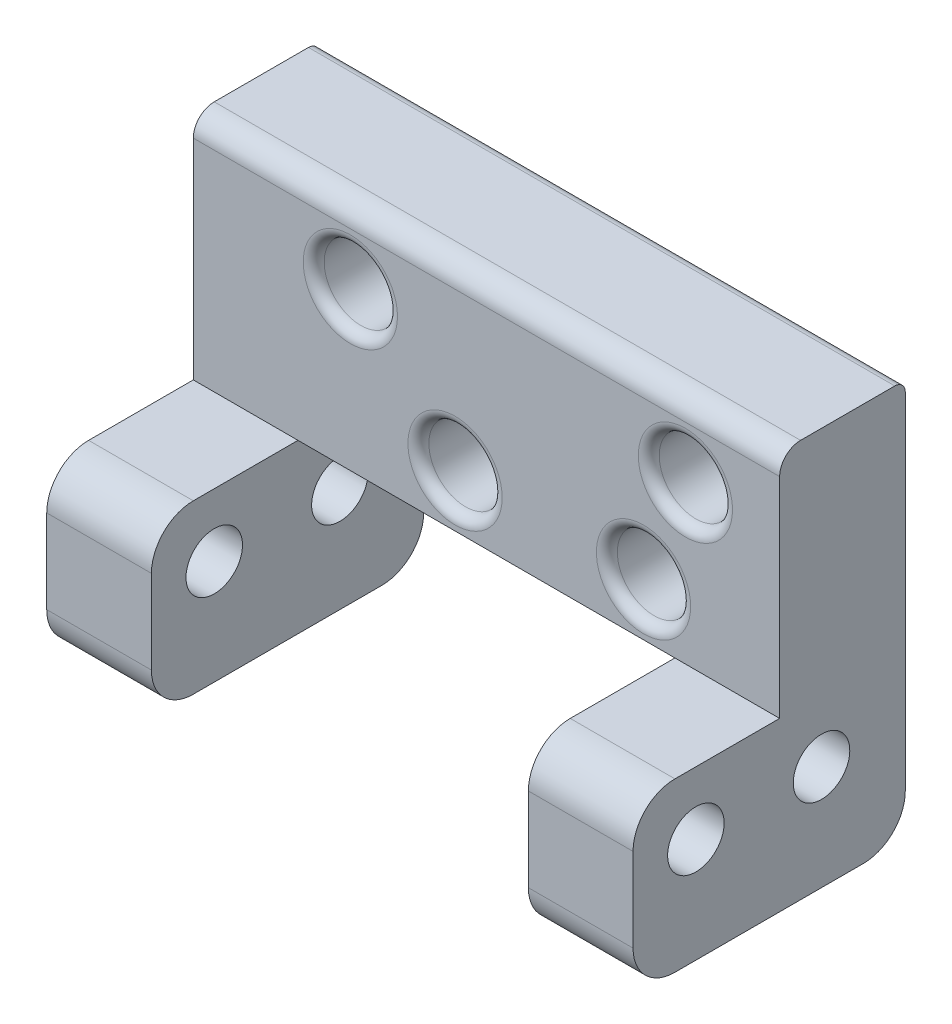
ISO-10303-21;
HEADER;
FILE_DESCRIPTION(('STEP AP214'),'2;1');
FILE_NAME('part.step','',(''),(''),'','','');
FILE_SCHEMA(('AUTOMOTIVE_DESIGN { 1 0 10303 214 1 1 1 1 }'));
ENDSEC;
DATA;
#1=APPLICATION_CONTEXT('core data for automotive mechanical design processes');
#2=APPLICATION_PROTOCOL_DEFINITION('international standard','automotive_design',2000,#1);
#3=PRODUCT_CONTEXT('',#1,'mechanical');
#4=PRODUCT('Part','Part','',(#3));
#5=PRODUCT_RELATED_PRODUCT_CATEGORY('part','',(#4));
#6=PRODUCT_DEFINITION_FORMATION('','',#4);
#7=PRODUCT_DEFINITION_CONTEXT('part definition',#1,'design');
#8=PRODUCT_DEFINITION('design','',#6,#7);
#9=PRODUCT_DEFINITION_SHAPE('','',#8);
#10=(LENGTH_UNIT() NAMED_UNIT(*) SI_UNIT(.MILLI.,.METRE.));
#11=(NAMED_UNIT(*) PLANE_ANGLE_UNIT() SI_UNIT($,.RADIAN.));
#12=(NAMED_UNIT(*) SI_UNIT($,.STERADIAN.) SOLID_ANGLE_UNIT());
#13=UNCERTAINTY_MEASURE_WITH_UNIT(LENGTH_MEASURE(1.E-05),#10,'distance_accuracy_value','');
#14=(GEOMETRIC_REPRESENTATION_CONTEXT(3) GLOBAL_UNCERTAINTY_ASSIGNED_CONTEXT((#13)) GLOBAL_UNIT_ASSIGNED_CONTEXT((#10,
#11,#12)) REPRESENTATION_CONTEXT('',''));
#15=CARTESIAN_POINT('',(0.,0.,0.));
#16=DIRECTION('',(0.,0.,1.));
#17=DIRECTION('',(1.,0.,0.));
#18=AXIS2_PLACEMENT_3D('',#15,#16,#17);
#19=CARTESIAN_POINT('',(0.,0.,6.));
#20=DIRECTION('',(0.,0.,1.));
#21=DIRECTION('',(1.,0.,0.));
#22=AXIS2_PLACEMENT_3D('',#19,#20,#21);
#23=PLANE('',#22);
#24=CARTESIAN_POINT('',(9.5,7.5,6.));
#25=DIRECTION('',(0.,0.,1.));
#26=DIRECTION('',(1.,0.,0.));
#27=AXIS2_PLACEMENT_3D('',#24,#25,#26);
#28=CIRCLE('',#27,2.25);
#29=CARTESIAN_POINT('',(11.75,7.5,6.));
#30=VERTEX_POINT('',#29);
#31=EDGE_CURVE('E316',#30,#30,#28,.F.);
#32=ORIENTED_EDGE('',*,*,#31,.T.);
#33=EDGE_LOOP('',(#32));
#34=FACE_BOUND('',#33,.T.);
#35=CARTESIAN_POINT('',(-6.49999999999999,7.5,6.));
#36=DIRECTION('',(0.,0.,1.));
#37=DIRECTION('',(1.,0.,0.));
#38=AXIS2_PLACEMENT_3D('',#35,#36,#37);
#39=CIRCLE('',#38,2.25);
#40=CARTESIAN_POINT('',(-4.24999999999999,7.5,6.));
#41=VERTEX_POINT('',#40);
#42=EDGE_CURVE('E313',#41,#41,#39,.F.);
#43=ORIENTED_EDGE('',*,*,#42,.T.);
#44=EDGE_LOOP('',(#43));
#45=FACE_BOUND('',#44,.T.);
#46=CARTESIAN_POINT('',(-1.5,2.5,6.));
#47=DIRECTION('',(0.,0.,1.));
#48=DIRECTION('',(1.,0.,0.));
#49=AXIS2_PLACEMENT_3D('',#46,#47,#48);
#50=CIRCLE('',#49,2.25);
#51=CARTESIAN_POINT('',(0.750000000000004,2.5,6.));
#52=VERTEX_POINT('',#51);
#53=EDGE_CURVE('E310',#52,#52,#50,.F.);
#54=ORIENTED_EDGE('',*,*,#53,.T.);
#55=EDGE_LOOP('',(#54));
#56=FACE_BOUND('',#55,.T.);
#57=CARTESIAN_POINT('',(7.5,2.5,6.));
#58=DIRECTION('',(0.,0.,1.));
#59=DIRECTION('',(1.,0.,0.));
#60=AXIS2_PLACEMENT_3D('',#57,#58,#59);
#61=CIRCLE('',#60,2.25);
#62=CARTESIAN_POINT('',(9.75,2.5,6.));
#63=VERTEX_POINT('',#62);
#64=EDGE_CURVE('E307',#63,#63,#61,.F.);
#65=ORIENTED_EDGE('',*,*,#64,.T.);
#66=EDGE_LOOP('',(#65));
#67=FACE_BOUND('',#66,.T.);
#68=DIRECTION('',(0.,1.,0.));
#69=VECTOR('',#68,1.);
#70=CARTESIAN_POINT('',(14.,11.,6.));
#71=LINE('',#70,#69);
#72=CARTESIAN_POINT('',(14.,0.,6.));
#73=VERTEX_POINT('',#72);
#74=CARTESIAN_POINT('',(14.,10.,6.));
#75=VERTEX_POINT('',#74);
#76=EDGE_CURVE('E178',#73,#75,#71,.T.);
#77=ORIENTED_EDGE('',*,*,#76,.T.);
#78=DIRECTION('',(-1.,0.,0.));
#79=VECTOR('',#78,1.);
#80=CARTESIAN_POINT('',(-14.,10.,6.));
#81=LINE('',#80,#79);
#82=CARTESIAN_POINT('',(-14.,10.,6.));
#83=VERTEX_POINT('',#82);
#84=EDGE_CURVE('E264',#75,#83,#81,.T.);
#85=ORIENTED_EDGE('',*,*,#84,.T.);
#86=DIRECTION('',(0.,-1.,0.));
#87=VECTOR('',#86,1.);
#88=CARTESIAN_POINT('',(-14.,11.,6.));
#89=LINE('',#88,#87);
#90=CARTESIAN_POINT('',(-14.,0.,6.));
#91=VERTEX_POINT('',#90);
#92=EDGE_CURVE('E179',#83,#91,#89,.T.);
#93=ORIENTED_EDGE('',*,*,#92,.T.);
#94=DIRECTION('',(-1.,0.,0.));
#95=VECTOR('',#94,1.);
#96=CARTESIAN_POINT('',(0.,0.,6.));
#97=LINE('',#96,#95);
#98=CARTESIAN_POINT('',(-9.,0.,6.));
#99=VERTEX_POINT('',#98);
#100=EDGE_CURVE('E191',#99,#91,#97,.T.);
#101=ORIENTED_EDGE('',*,*,#100,.F.);
#102=DIRECTION('',(1.,0.,0.));
#103=VECTOR('',#102,1.);
#104=CARTESIAN_POINT('',(-9.,0.,6.));
#105=LINE('',#104,#103);
#106=CARTESIAN_POINT('',(9.,0.,6.));
#107=VERTEX_POINT('',#106);
#108=EDGE_CURVE('E168',#99,#107,#105,.T.);
#109=ORIENTED_EDGE('',*,*,#108,.T.);
#110=DIRECTION('',(1.,0.,0.));
#111=VECTOR('',#110,1.);
#112=CARTESIAN_POINT('',(-1.63014581273465,0.,6.));
#113=LINE('',#112,#111);
#114=EDGE_CURVE('E225',#107,#73,#113,.T.);
#115=ORIENTED_EDGE('',*,*,#114,.T.);
#116=EDGE_LOOP('',(#77,#85,#93,#101,#109,#115));
#117=FACE_BOUND('',#116,.T.);
#118=ADVANCED_FACE('F34',(#34,#45,#56,#67,#117),#23,.T.);
#119=CARTESIAN_POINT('',(-14.,11.,6.));
#120=DIRECTION('',(1.,0.,0.));
#121=DIRECTION('',(0.,1.,0.));
#122=AXIS2_PLACEMENT_3D('',#119,#120,#121);
#123=PLANE('',#122);
#124=CARTESIAN_POINT('',(-14.,-3.,10.));
#125=DIRECTION('',(1.,0.,0.));
#126=DIRECTION('',(0.,1.,0.));
#127=AXIS2_PLACEMENT_3D('',#124,#125,#126);
#128=CIRCLE('',#127,1.35);
#129=CARTESIAN_POINT('',(-14.,-1.65,10.));
#130=VERTEX_POINT('',#129);
#131=EDGE_CURVE('E271',#130,#130,#128,.T.);
#132=ORIENTED_EDGE('',*,*,#131,.T.);
#133=EDGE_LOOP('',(#132));
#134=FACE_BOUND('',#133,.T.);
#135=CARTESIAN_POINT('',(-14.,-3.,4.));
#136=DIRECTION('',(1.,0.,0.));
#137=DIRECTION('',(0.,1.,0.));
#138=AXIS2_PLACEMENT_3D('',#135,#136,#137);
#139=CIRCLE('',#138,1.35);
#140=CARTESIAN_POINT('',(-14.,-1.65,4.));
#141=VERTEX_POINT('',#140);
#142=EDGE_CURVE('E267',#141,#141,#139,.T.);
#143=ORIENTED_EDGE('',*,*,#142,.T.);
#144=EDGE_LOOP('',(#143));
#145=FACE_BOUND('',#144,.T.);
#146=DIRECTION('',(0.,0.,-1.));
#147=VECTOR('',#146,1.);
#148=CARTESIAN_POINT('',(-14.,-8.,6.));
#149=LINE('',#148,#147);
#150=CARTESIAN_POINT('',(-14.,-8.,11.));
#151=VERTEX_POINT('',#150);
#152=CARTESIAN_POINT('',(-14.,-8.,2.));
#153=VERTEX_POINT('',#152);
#154=EDGE_CURVE('E261',#151,#153,#149,.T.);
#155=ORIENTED_EDGE('',*,*,#154,.F.);
#156=CARTESIAN_POINT('',(-14.,-6.,11.));
#157=DIRECTION('',(1.,0.,0.));
#158=DIRECTION('',(0.,1.,0.));
#159=AXIS2_PLACEMENT_3D('',#156,#157,#158);
#160=CIRCLE('',#159,2.);
#161=CARTESIAN_POINT('',(-14.,-6.,13.));
#162=VERTEX_POINT('',#161);
#163=EDGE_CURVE('E376',#151,#162,#160,.F.);
#164=ORIENTED_EDGE('',*,*,#163,.T.);
#165=DIRECTION('',(0.,1.,0.));
#166=VECTOR('',#165,1.);
#167=CARTESIAN_POINT('',(-14.,-8.,13.));
#168=LINE('',#167,#166);
#169=CARTESIAN_POINT('',(-14.,-1.99999999999999,13.));
#170=VERTEX_POINT('',#169);
#171=EDGE_CURVE('E204',#162,#170,#168,.T.);
#172=ORIENTED_EDGE('',*,*,#171,.T.);
#173=CARTESIAN_POINT('',(-14.,-2.,11.));
#174=DIRECTION('',(1.,0.,0.));
#175=DIRECTION('',(0.,1.,0.));
#176=AXIS2_PLACEMENT_3D('',#173,#174,#175);
#177=CIRCLE('',#176,2.);
#178=CARTESIAN_POINT('',(-14.,0.,11.));
#179=VERTEX_POINT('',#178);
#180=EDGE_CURVE('E372',#170,#179,#177,.F.);
#181=ORIENTED_EDGE('',*,*,#180,.T.);
#182=DIRECTION('',(0.,0.,-1.));
#183=VECTOR('',#182,1.);
#184=CARTESIAN_POINT('',(-14.,0.,0.));
#185=LINE('',#184,#183);
#186=EDGE_CURVE('E200',#179,#91,#185,.T.);
#187=ORIENTED_EDGE('',*,*,#186,.T.);
#188=ORIENTED_EDGE('',*,*,#92,.F.);
#189=CARTESIAN_POINT('',(-14.,10.,5.));
#190=DIRECTION('',(1.,0.,0.));
#191=DIRECTION('',(0.,1.,0.));
#192=AXIS2_PLACEMENT_3D('',#189,#190,#191);
#193=CIRCLE('',#192,1.);
#194=CARTESIAN_POINT('',(-14.,11.,5.));
#195=VERTEX_POINT('',#194);
#196=EDGE_CURVE('E273',#83,#195,#193,.F.);
#197=ORIENTED_EDGE('',*,*,#196,.T.);
#198=DIRECTION('',(0.,0.,-1.));
#199=VECTOR('',#198,1.);
#200=CARTESIAN_POINT('',(-14.,11.,6.));
#201=LINE('',#200,#199);
#202=CARTESIAN_POINT('',(-14.,11.,0.5));
#203=VERTEX_POINT('',#202);
#204=EDGE_CURVE('E237',#195,#203,#201,.T.);
#205=ORIENTED_EDGE('',*,*,#204,.T.);
#206=CARTESIAN_POINT('',(-14.,10.5,0.5));
#207=DIRECTION('',(1.,0.,0.));
#208=DIRECTION('',(0.,1.,0.));
#209=AXIS2_PLACEMENT_3D('',#206,#207,#208);
#210=CIRCLE('',#209,0.5);
#211=CARTESIAN_POINT('',(-14.,10.5,0.));
#212=VERTEX_POINT('',#211);
#213=EDGE_CURVE('E282',#203,#212,#210,.F.);
#214=ORIENTED_EDGE('',*,*,#213,.T.);
#215=DIRECTION('',(0.,-1.,0.));
#216=VECTOR('',#215,1.);
#217=CARTESIAN_POINT('',(-14.,11.,0.));
#218=LINE('',#217,#216);
#219=CARTESIAN_POINT('',(-14.,-6.,0.));
#220=VERTEX_POINT('',#219);
#221=EDGE_CURVE('E233',#212,#220,#218,.T.);
#222=ORIENTED_EDGE('',*,*,#221,.T.);
#223=CARTESIAN_POINT('',(-14.,-6.,2.));
#224=DIRECTION('',(1.,0.,0.));
#225=DIRECTION('',(0.,1.,0.));
#226=AXIS2_PLACEMENT_3D('',#223,#224,#225);
#227=CIRCLE('',#226,2.);
#228=EDGE_CURVE('E374',#220,#153,#227,.F.);
#229=ORIENTED_EDGE('',*,*,#228,.T.);
#230=EDGE_LOOP('',(#155,#164,#172,#181,#187,#188,#197,#205,#214,#222,#229));
#231=FACE_BOUND('',#230,.T.);
#232=ADVANCED_FACE('F395',(#134,#145,#231),#123,.F.);
#233=CARTESIAN_POINT('',(-14.,-8.,6.));
#234=DIRECTION('',(0.,1.,0.));
#235=DIRECTION('',(0.,0.,1.));
#236=AXIS2_PLACEMENT_3D('',#233,#234,#235);
#237=PLANE('',#236);
#238=DIRECTION('',(0.,0.,-1.));
#239=VECTOR('',#238,1.);
#240=CARTESIAN_POINT('',(-9.,-8.,6.));
#241=LINE('',#240,#239);
#242=CARTESIAN_POINT('',(-9.,-8.,11.));
#243=VERTEX_POINT('',#242);
#244=CARTESIAN_POINT('',(-9.,-8.,2.));
#245=VERTEX_POINT('',#244);
#246=EDGE_CURVE('E187',#243,#245,#241,.T.);
#247=ORIENTED_EDGE('',*,*,#246,.F.);
#248=DIRECTION('',(-1.,0.,0.));
#249=VECTOR('',#248,1.);
#250=CARTESIAN_POINT('',(-14.,-8.,11.));
#251=LINE('',#250,#249);
#252=EDGE_CURVE('E369',#243,#151,#251,.T.);
#253=ORIENTED_EDGE('',*,*,#252,.T.);
#254=ORIENTED_EDGE('',*,*,#154,.T.);
#255=DIRECTION('',(1.,0.,0.));
#256=VECTOR('',#255,1.);
#257=CARTESIAN_POINT('',(-14.,-8.,2.));
#258=LINE('',#257,#256);
#259=EDGE_CURVE('E366',#153,#245,#258,.T.);
#260=ORIENTED_EDGE('',*,*,#259,.T.);
#261=EDGE_LOOP('',(#247,#253,#254,#260));
#262=FACE_BOUND('',#261,.T.);
#263=ADVANCED_FACE('F390',(#262),#237,.F.);
#264=CARTESIAN_POINT('',(-9.,0.,6.));
#265=DIRECTION('',(-1.,0.,0.));
#266=DIRECTION('',(0.,-1.,0.));
#267=AXIS2_PLACEMENT_3D('',#264,#265,#266);
#268=PLANE('',#267);
#269=CARTESIAN_POINT('',(-9.,-3.,10.));
#270=DIRECTION('',(-1.,0.,0.));
#271=DIRECTION('',(0.,-1.,0.));
#272=AXIS2_PLACEMENT_3D('',#269,#270,#271);
#273=CIRCLE('',#272,1.35);
#274=CARTESIAN_POINT('',(-9.,-4.35,10.));
#275=VERTEX_POINT('',#274);
#276=EDGE_CURVE('E268',#275,#275,#273,.F.);
#277=ORIENTED_EDGE('',*,*,#276,.F.);
#278=EDGE_LOOP('',(#277));
#279=FACE_BOUND('',#278,.T.);
#280=CARTESIAN_POINT('',(-9.,-3.,4.));
#281=DIRECTION('',(-1.,0.,0.));
#282=DIRECTION('',(0.,-1.,0.));
#283=AXIS2_PLACEMENT_3D('',#280,#281,#282);
#284=CIRCLE('',#283,1.35);
#285=CARTESIAN_POINT('',(-9.,-4.35,4.));
#286=VERTEX_POINT('',#285);
#287=EDGE_CURVE('E207',#286,#286,#284,.F.);
#288=ORIENTED_EDGE('',*,*,#287,.F.);
#289=EDGE_LOOP('',(#288));
#290=FACE_BOUND('',#289,.T.);
#291=DIRECTION('',(0.,-1.,0.));
#292=VECTOR('',#291,1.);
#293=CARTESIAN_POINT('',(-9.,-8.00000000000001,13.));
#294=LINE('',#293,#292);
#295=CARTESIAN_POINT('',(-9.,-2.,13.));
#296=VERTEX_POINT('',#295);
#297=CARTESIAN_POINT('',(-9.,-6.,13.));
#298=VERTEX_POINT('',#297);
#299=EDGE_CURVE('E198',#296,#298,#294,.T.);
#300=ORIENTED_EDGE('',*,*,#299,.T.);
#301=CARTESIAN_POINT('',(-9.,-6.,11.));
#302=DIRECTION('',(-1.,0.,0.));
#303=DIRECTION('',(0.,-1.,0.));
#304=AXIS2_PLACEMENT_3D('',#301,#302,#303);
#305=CIRCLE('',#304,2.);
#306=EDGE_CURVE('E42',#298,#243,#305,.F.);
#307=ORIENTED_EDGE('',*,*,#306,.T.);
#308=ORIENTED_EDGE('',*,*,#246,.T.);
#309=CARTESIAN_POINT('',(-9.,-6.,2.));
#310=DIRECTION('',(-1.,0.,0.));
#311=DIRECTION('',(0.,-1.,0.));
#312=AXIS2_PLACEMENT_3D('',#309,#310,#311);
#313=CIRCLE('',#312,2.);
#314=CARTESIAN_POINT('',(-9.,-6.,0.));
#315=VERTEX_POINT('',#314);
#316=EDGE_CURVE('E384',#245,#315,#313,.F.);
#317=ORIENTED_EDGE('',*,*,#316,.T.);
#318=DIRECTION('',(0.,1.,0.));
#319=VECTOR('',#318,1.);
#320=CARTESIAN_POINT('',(-9.,0.,0.));
#321=LINE('',#320,#319);
#322=CARTESIAN_POINT('',(-9.,0.,0.));
#323=VERTEX_POINT('',#322);
#324=EDGE_CURVE('E186',#315,#323,#321,.T.);
#325=ORIENTED_EDGE('',*,*,#324,.T.);
#326=DIRECTION('',(0.,0.,-1.));
#327=VECTOR('',#326,1.);
#328=CARTESIAN_POINT('',(-9.,0.,6.));
#329=LINE('',#328,#327);
#330=EDGE_CURVE('E171',#99,#323,#329,.T.);
#331=ORIENTED_EDGE('',*,*,#330,.F.);
#332=DIRECTION('',(0.,0.,1.));
#333=VECTOR('',#332,1.);
#334=CARTESIAN_POINT('',(-9.,0.,0.));
#335=LINE('',#334,#333);
#336=CARTESIAN_POINT('',(-9.,0.,11.));
#337=VERTEX_POINT('',#336);
#338=EDGE_CURVE('E183',#99,#337,#335,.T.);
#339=ORIENTED_EDGE('',*,*,#338,.T.);
#340=CARTESIAN_POINT('',(-9.,-2.,11.));
#341=DIRECTION('',(-1.,0.,0.));
#342=DIRECTION('',(0.,-1.,0.));
#343=AXIS2_PLACEMENT_3D('',#340,#341,#342);
#344=CIRCLE('',#343,2.);
#345=EDGE_CURVE('E382',#337,#296,#344,.F.);
#346=ORIENTED_EDGE('',*,*,#345,.T.);
#347=EDGE_LOOP('',(#300,#307,#308,#317,#325,#331,#339,#346));
#348=FACE_BOUND('',#347,.T.);
#349=ADVANCED_FACE('F182',(#279,#290,#348),#268,.F.);
#350=CARTESIAN_POINT('',(-9.,0.,6.));
#351=DIRECTION('',(0.,1.,0.));
#352=DIRECTION('',(0.,0.,1.));
#353=AXIS2_PLACEMENT_3D('',#350,#351,#352);
#354=PLANE('',#353);
#355=DIRECTION('',(1.,0.,0.));
#356=VECTOR('',#355,1.);
#357=CARTESIAN_POINT('',(-9.,0.,0.));
#358=LINE('',#357,#356);
#359=CARTESIAN_POINT('',(9.,0.,0.));
#360=VERTEX_POINT('',#359);
#361=EDGE_CURVE('E241',#323,#360,#358,.T.);
#362=ORIENTED_EDGE('',*,*,#361,.T.);
#363=DIRECTION('',(0.,0.,-1.));
#364=VECTOR('',#363,1.);
#365=CARTESIAN_POINT('',(9.,0.,6.));
#366=LINE('',#365,#364);
#367=EDGE_CURVE('E174',#107,#360,#366,.T.);
#368=ORIENTED_EDGE('',*,*,#367,.F.);
#369=ORIENTED_EDGE('',*,*,#108,.F.);
#370=ORIENTED_EDGE('',*,*,#330,.T.);
#371=EDGE_LOOP('',(#362,#368,#369,#370));
#372=FACE_BOUND('',#371,.T.);
#373=ADVANCED_FACE('F170',(#372),#354,.F.);
#374=CARTESIAN_POINT('',(9.,0.,6.));
#375=DIRECTION('',(1.,0.,0.));
#376=DIRECTION('',(0.,1.,0.));
#377=AXIS2_PLACEMENT_3D('',#374,#375,#376);
#378=PLANE('',#377);
#379=CARTESIAN_POINT('',(9.,-3.,10.));
#380=DIRECTION('',(1.,0.,0.));
#381=DIRECTION('',(0.,1.,0.));
#382=AXIS2_PLACEMENT_3D('',#379,#380,#381);
#383=CIRCLE('',#382,1.35);
#384=CARTESIAN_POINT('',(9.,-1.65,10.));
#385=VERTEX_POINT('',#384);
#386=EDGE_CURVE('E211',#385,#385,#383,.T.);
#387=ORIENTED_EDGE('',*,*,#386,.T.);
#388=EDGE_LOOP('',(#387));
#389=FACE_BOUND('',#388,.T.);
#390=CARTESIAN_POINT('',(9.,-3.,4.));
#391=DIRECTION('',(1.,0.,0.));
#392=DIRECTION('',(0.,1.,0.));
#393=AXIS2_PLACEMENT_3D('',#390,#391,#392);
#394=CIRCLE('',#393,1.35);
#395=CARTESIAN_POINT('',(9.,-1.65,4.));
#396=VERTEX_POINT('',#395);
#397=EDGE_CURVE('E217',#396,#396,#394,.T.);
#398=ORIENTED_EDGE('',*,*,#397,.T.);
#399=EDGE_LOOP('',(#398));
#400=FACE_BOUND('',#399,.T.);
#401=DIRECTION('',(0.,-1.,0.));
#402=VECTOR('',#401,1.);
#403=CARTESIAN_POINT('',(9.,0.,0.));
#404=LINE('',#403,#402);
#405=CARTESIAN_POINT('',(9.,-6.,0.));
#406=VERTEX_POINT('',#405);
#407=EDGE_CURVE('E243',#360,#406,#404,.T.);
#408=ORIENTED_EDGE('',*,*,#407,.T.);
#409=CARTESIAN_POINT('',(9.,-6.,2.));
#410=DIRECTION('',(1.,0.,0.));
#411=DIRECTION('',(0.,1.,0.));
#412=AXIS2_PLACEMENT_3D('',#409,#410,#411);
#413=CIRCLE('',#412,2.);
#414=CARTESIAN_POINT('',(9.,-8.,2.));
#415=VERTEX_POINT('',#414);
#416=EDGE_CURVE('E356',#406,#415,#413,.F.);
#417=ORIENTED_EDGE('',*,*,#416,.T.);
#418=DIRECTION('',(0.,0.,-1.));
#419=VECTOR('',#418,1.);
#420=CARTESIAN_POINT('',(9.,-8.,6.));
#421=LINE('',#420,#419);
#422=CARTESIAN_POINT('',(9.,-8.,11.));
#423=VERTEX_POINT('',#422);
#424=EDGE_CURVE('E255',#423,#415,#421,.T.);
#425=ORIENTED_EDGE('',*,*,#424,.F.);
#426=CARTESIAN_POINT('',(9.,-6.,11.));
#427=DIRECTION('',(1.,0.,0.));
#428=DIRECTION('',(0.,1.,0.));
#429=AXIS2_PLACEMENT_3D('',#426,#427,#428);
#430=CIRCLE('',#429,2.);
#431=CARTESIAN_POINT('',(9.,-6.,13.));
#432=VERTEX_POINT('',#431);
#433=EDGE_CURVE('E354',#423,#432,#430,.F.);
#434=ORIENTED_EDGE('',*,*,#433,.T.);
#435=DIRECTION('',(0.,1.,0.));
#436=VECTOR('',#435,1.);
#437=CARTESIAN_POINT('',(9.,-7.99999999999999,13.));
#438=LINE('',#437,#436);
#439=CARTESIAN_POINT('',(9.,-2.,13.));
#440=VERTEX_POINT('',#439);
#441=EDGE_CURVE('E221',#432,#440,#438,.T.);
#442=ORIENTED_EDGE('',*,*,#441,.T.);
#443=CARTESIAN_POINT('',(9.,-2.,11.));
#444=DIRECTION('',(1.,0.,0.));
#445=DIRECTION('',(0.,1.,0.));
#446=AXIS2_PLACEMENT_3D('',#443,#444,#445);
#447=CIRCLE('',#446,2.);
#448=CARTESIAN_POINT('',(9.,0.,11.));
#449=VERTEX_POINT('',#448);
#450=EDGE_CURVE('E352',#440,#449,#447,.F.);
#451=ORIENTED_EDGE('',*,*,#450,.T.);
#452=DIRECTION('',(0.,0.,-1.));
#453=VECTOR('',#452,1.);
#454=CARTESIAN_POINT('',(9.,0.,6.));
#455=LINE('',#454,#453);
#456=EDGE_CURVE('E224',#449,#107,#455,.T.);
#457=ORIENTED_EDGE('',*,*,#456,.T.);
#458=ORIENTED_EDGE('',*,*,#367,.T.);
#459=EDGE_LOOP('',(#408,#417,#425,#434,#442,#451,#457,#458));
#460=FACE_BOUND('',#459,.T.);
#461=ADVANCED_FACE('F427',(#389,#400,#460),#378,.F.);
#462=CARTESIAN_POINT('',(14.,-8.,6.));
#463=DIRECTION('',(0.,1.,0.));
#464=DIRECTION('',(0.,0.,1.));
#465=AXIS2_PLACEMENT_3D('',#462,#463,#464);
#466=PLANE('',#465);
#467=ORIENTED_EDGE('',*,*,#424,.T.);
#468=DIRECTION('',(1.,0.,0.));
#469=VECTOR('',#468,1.);
#470=CARTESIAN_POINT('',(14.,-8.,2.));
#471=LINE('',#470,#469);
#472=CARTESIAN_POINT('',(14.,-8.,2.));
#473=VERTEX_POINT('',#472);
#474=EDGE_CURVE('E339',#415,#473,#471,.T.);
#475=ORIENTED_EDGE('',*,*,#474,.T.);
#476=DIRECTION('',(0.,0.,-1.));
#477=VECTOR('',#476,1.);
#478=CARTESIAN_POINT('',(14.,-8.,6.));
#479=LINE('',#478,#477);
#480=CARTESIAN_POINT('',(14.,-8.,11.));
#481=VERTEX_POINT('',#480);
#482=EDGE_CURVE('E252',#481,#473,#479,.T.);
#483=ORIENTED_EDGE('',*,*,#482,.F.);
#484=DIRECTION('',(1.,0.,0.));
#485=VECTOR('',#484,1.);
#486=CARTESIAN_POINT('',(9.,-8.,11.));
#487=LINE('',#486,#485);
#488=EDGE_CURVE('E337',#481,#423,#487,.F.);
#489=ORIENTED_EDGE('',*,*,#488,.T.);
#490=EDGE_LOOP('',(#467,#475,#483,#489));
#491=FACE_BOUND('',#490,.T.);
#492=ADVANCED_FACE('F435',(#491),#466,.F.);
#493=CARTESIAN_POINT('',(14.,11.,6.));
#494=DIRECTION('',(-1.,0.,0.));
#495=DIRECTION('',(0.,-1.,0.));
#496=AXIS2_PLACEMENT_3D('',#493,#494,#495);
#497=PLANE('',#496);
#498=CARTESIAN_POINT('',(14.,-3.,10.));
#499=DIRECTION('',(1.,0.,0.));
#500=DIRECTION('',(0.,1.,0.));
#501=AXIS2_PLACEMENT_3D('',#498,#499,#500);
#502=CIRCLE('',#501,1.35);
#503=CARTESIAN_POINT('',(14.,-1.65,10.));
#504=VERTEX_POINT('',#503);
#505=EDGE_CURVE('E195',#504,#504,#502,.T.);
#506=ORIENTED_EDGE('',*,*,#505,.F.);
#507=EDGE_LOOP('',(#506));
#508=FACE_BOUND('',#507,.T.);
#509=CARTESIAN_POINT('',(14.,-3.,4.));
#510=DIRECTION('',(1.,0.,0.));
#511=DIRECTION('',(0.,1.,0.));
#512=AXIS2_PLACEMENT_3D('',#509,#510,#511);
#513=CIRCLE('',#512,1.35);
#514=CARTESIAN_POINT('',(14.,-1.65,4.));
#515=VERTEX_POINT('',#514);
#516=EDGE_CURVE('E214',#515,#515,#513,.T.);
#517=ORIENTED_EDGE('',*,*,#516,.F.);
#518=EDGE_LOOP('',(#517));
#519=FACE_BOUND('',#518,.T.);
#520=ORIENTED_EDGE('',*,*,#482,.T.);
#521=CARTESIAN_POINT('',(14.,-6.,2.));
#522=DIRECTION('',(-1.,0.,0.));
#523=DIRECTION('',(0.,-1.,0.));
#524=AXIS2_PLACEMENT_3D('',#521,#522,#523);
#525=CIRCLE('',#524,2.);
#526=CARTESIAN_POINT('',(14.,-6.,0.));
#527=VERTEX_POINT('',#526);
#528=EDGE_CURVE('E346',#473,#527,#525,.F.);
#529=ORIENTED_EDGE('',*,*,#528,.T.);
#530=DIRECTION('',(0.,1.,0.));
#531=VECTOR('',#530,1.);
#532=CARTESIAN_POINT('',(14.,11.,0.));
#533=LINE('',#532,#531);
#534=CARTESIAN_POINT('',(14.,10.5,0.));
#535=VERTEX_POINT('',#534);
#536=EDGE_CURVE('E234',#527,#535,#533,.T.);
#537=ORIENTED_EDGE('',*,*,#536,.T.);
#538=CARTESIAN_POINT('',(14.,10.5,0.5));
#539=DIRECTION('',(-1.,0.,0.));
#540=DIRECTION('',(0.,-1.,0.));
#541=AXIS2_PLACEMENT_3D('',#538,#539,#540);
#542=CIRCLE('',#541,0.5);
#543=CARTESIAN_POINT('',(14.,11.,0.5));
#544=VERTEX_POINT('',#543);
#545=EDGE_CURVE('E299',#535,#544,#542,.F.);
#546=ORIENTED_EDGE('',*,*,#545,.T.);
#547=DIRECTION('',(0.,0.,-1.));
#548=VECTOR('',#547,1.);
#549=CARTESIAN_POINT('',(14.,11.,6.));
#550=LINE('',#549,#548);
#551=CARTESIAN_POINT('',(14.,11.,5.));
#552=VERTEX_POINT('',#551);
#553=EDGE_CURVE('E249',#552,#544,#550,.T.);
#554=ORIENTED_EDGE('',*,*,#553,.F.);
#555=CARTESIAN_POINT('',(14.,10.,5.));
#556=DIRECTION('',(-1.,0.,0.));
#557=DIRECTION('',(0.,-1.,0.));
#558=AXIS2_PLACEMENT_3D('',#555,#556,#557);
#559=CIRCLE('',#558,1.);
#560=EDGE_CURVE('E277',#552,#75,#559,.F.);
#561=ORIENTED_EDGE('',*,*,#560,.T.);
#562=ORIENTED_EDGE('',*,*,#76,.F.);
#563=DIRECTION('',(0.,0.,1.));
#564=VECTOR('',#563,1.);
#565=CARTESIAN_POINT('',(14.,0.,6.));
#566=LINE('',#565,#564);
#567=CARTESIAN_POINT('',(14.,0.,11.));
#568=VERTEX_POINT('',#567);
#569=EDGE_CURVE('E220',#73,#568,#566,.T.);
#570=ORIENTED_EDGE('',*,*,#569,.T.);
#571=CARTESIAN_POINT('',(14.,-2.,11.));
#572=DIRECTION('',(-1.,0.,0.));
#573=DIRECTION('',(0.,-1.,0.));
#574=AXIS2_PLACEMENT_3D('',#571,#572,#573);
#575=CIRCLE('',#574,2.);
#576=CARTESIAN_POINT('',(14.,-2.,13.));
#577=VERTEX_POINT('',#576);
#578=EDGE_CURVE('E342',#568,#577,#575,.F.);
#579=ORIENTED_EDGE('',*,*,#578,.T.);
#580=DIRECTION('',(0.,-1.,0.));
#581=VECTOR('',#580,1.);
#582=CARTESIAN_POINT('',(14.,-8.,13.));
#583=LINE('',#582,#581);
#584=CARTESIAN_POINT('',(14.,-6.,13.));
#585=VERTEX_POINT('',#584);
#586=EDGE_CURVE('E228',#577,#585,#583,.T.);
#587=ORIENTED_EDGE('',*,*,#586,.T.);
#588=CARTESIAN_POINT('',(14.,-6.,11.));
#589=DIRECTION('',(-1.,0.,0.));
#590=DIRECTION('',(0.,-1.,0.));
#591=AXIS2_PLACEMENT_3D('',#588,#589,#590);
#592=CIRCLE('',#591,2.);
#593=EDGE_CURVE('E344',#585,#481,#592,.F.);
#594=ORIENTED_EDGE('',*,*,#593,.T.);
#595=EDGE_LOOP('',(#520,#529,#537,#546,#554,#561,#562,#570,#579,#587,#594));
#596=FACE_BOUND('',#595,.T.);
#597=ADVANCED_FACE('F411',(#508,#519,#596),#497,.F.);
#598=CARTESIAN_POINT('',(14.,11.,6.));
#599=DIRECTION('',(0.,-1.,0.));
#600=DIRECTION('',(1.,0.,0.));
#601=AXIS2_PLACEMENT_3D('',#598,#599,#600);
#602=PLANE('',#601);
#603=ORIENTED_EDGE('',*,*,#553,.T.);
#604=DIRECTION('',(-1.,0.,0.));
#605=VECTOR('',#604,1.);
#606=CARTESIAN_POINT('',(14.,11.,0.5));
#607=LINE('',#606,#605);
#608=EDGE_CURVE('E279',#544,#203,#607,.T.);
#609=ORIENTED_EDGE('',*,*,#608,.T.);
#610=ORIENTED_EDGE('',*,*,#204,.F.);
#611=DIRECTION('',(-1.,0.,0.));
#612=VECTOR('',#611,1.);
#613=CARTESIAN_POINT('',(14.,11.,5.));
#614=LINE('',#613,#612);
#615=EDGE_CURVE('E275',#195,#552,#614,.F.);
#616=ORIENTED_EDGE('',*,*,#615,.T.);
#617=EDGE_LOOP('',(#603,#609,#610,#616));
#618=FACE_BOUND('',#617,.T.);
#619=ADVANCED_FACE('F404',(#618),#602,.F.);
#620=CARTESIAN_POINT('',(0.,0.,0.));
#621=DIRECTION('',(0.,0.,1.));
#622=DIRECTION('',(1.,0.,0.));
#623=AXIS2_PLACEMENT_3D('',#620,#621,#622);
#624=PLANE('',#623);
#625=CARTESIAN_POINT('',(-6.49999999999999,7.5,0.));
#626=DIRECTION('',(0.,0.,1.));
#627=DIRECTION('',(1.,0.,0.));
#628=AXIS2_PLACEMENT_3D('',#625,#626,#627);
#629=CIRCLE('',#628,2.25);
#630=CARTESIAN_POINT('',(-4.24999999999999,7.5,0.));
#631=VERTEX_POINT('',#630);
#632=EDGE_CURVE('E293',#631,#631,#629,.T.);
#633=ORIENTED_EDGE('',*,*,#632,.T.);
#634=EDGE_LOOP('',(#633));
#635=FACE_BOUND('',#634,.T.);
#636=CARTESIAN_POINT('',(-1.5,2.5,0.));
#637=DIRECTION('',(0.,0.,1.));
#638=DIRECTION('',(1.,0.,0.));
#639=AXIS2_PLACEMENT_3D('',#636,#637,#638);
#640=CIRCLE('',#639,2.25);
#641=CARTESIAN_POINT('',(0.750000000000004,2.5,0.));
#642=VERTEX_POINT('',#641);
#643=EDGE_CURVE('E290',#642,#642,#640,.T.);
#644=ORIENTED_EDGE('',*,*,#643,.T.);
#645=EDGE_LOOP('',(#644));
#646=FACE_BOUND('',#645,.T.);
#647=CARTESIAN_POINT('',(7.5,2.5,0.));
#648=DIRECTION('',(0.,0.,1.));
#649=DIRECTION('',(1.,0.,0.));
#650=AXIS2_PLACEMENT_3D('',#647,#648,#649);
#651=CIRCLE('',#650,2.25);
#652=CARTESIAN_POINT('',(9.75,2.5,0.));
#653=VERTEX_POINT('',#652);
#654=EDGE_CURVE('E287',#653,#653,#651,.T.);
#655=ORIENTED_EDGE('',*,*,#654,.T.);
#656=EDGE_LOOP('',(#655));
#657=FACE_BOUND('',#656,.T.);
#658=CARTESIAN_POINT('',(9.5,7.5,0.));
#659=DIRECTION('',(0.,0.,1.));
#660=DIRECTION('',(1.,0.,0.));
#661=AXIS2_PLACEMENT_3D('',#658,#659,#660);
#662=CIRCLE('',#661,2.25);
#663=CARTESIAN_POINT('',(11.75,7.5,0.));
#664=VERTEX_POINT('',#663);
#665=EDGE_CURVE('E284',#664,#664,#662,.T.);
#666=ORIENTED_EDGE('',*,*,#665,.T.);
#667=EDGE_LOOP('',(#666));
#668=FACE_BOUND('',#667,.T.);
#669=ORIENTED_EDGE('',*,*,#536,.F.);
#670=DIRECTION('',(1.,0.,0.));
#671=VECTOR('',#670,1.);
#672=CARTESIAN_POINT('',(0.,-6.,0.));
#673=LINE('',#672,#671);
#674=EDGE_CURVE('E350',#527,#406,#673,.F.);
#675=ORIENTED_EDGE('',*,*,#674,.T.);
#676=ORIENTED_EDGE('',*,*,#407,.F.);
#677=ORIENTED_EDGE('',*,*,#361,.F.);
#678=ORIENTED_EDGE('',*,*,#324,.F.);
#679=DIRECTION('',(1.,0.,0.));
#680=VECTOR('',#679,1.);
#681=CARTESIAN_POINT('',(0.,-6.,0.));
#682=LINE('',#681,#680);
#683=EDGE_CURVE('E348',#315,#220,#682,.F.);
#684=ORIENTED_EDGE('',*,*,#683,.T.);
#685=ORIENTED_EDGE('',*,*,#221,.F.);
#686=DIRECTION('',(-1.,0.,0.));
#687=VECTOR('',#686,1.);
#688=CARTESIAN_POINT('',(0.,10.5,0.));
#689=LINE('',#688,#687);
#690=EDGE_CURVE('E296',#212,#535,#689,.F.);
#691=ORIENTED_EDGE('',*,*,#690,.T.);
#692=EDGE_LOOP('',(#669,#675,#676,#677,#678,#684,#685,#691));
#693=FACE_BOUND('',#692,.T.);
#694=ADVANCED_FACE('F443',(#635,#646,#657,#668,#693),#624,.F.);
#695=CARTESIAN_POINT('',(-1.63014581273465,-7.99999999999999,13.));
#696=DIRECTION('',(0.,0.,1.));
#697=DIRECTION('',(1.,0.,0.));
#698=AXIS2_PLACEMENT_3D('',#695,#696,#697);
#699=PLANE('',#698);
#700=ORIENTED_EDGE('',*,*,#441,.F.);
#701=DIRECTION('',(1.,0.,0.));
#702=VECTOR('',#701,1.);
#703=CARTESIAN_POINT('',(14.,-6.,13.));
#704=LINE('',#703,#702);
#705=EDGE_CURVE('E360',#432,#585,#704,.T.);
#706=ORIENTED_EDGE('',*,*,#705,.T.);
#707=ORIENTED_EDGE('',*,*,#586,.F.);
#708=DIRECTION('',(1.,0.,0.));
#709=VECTOR('',#708,1.);
#710=CARTESIAN_POINT('',(-1.63014581273465,-1.99999999999999,13.));
#711=LINE('',#710,#709);
#712=EDGE_CURVE('E358',#577,#440,#711,.F.);
#713=ORIENTED_EDGE('',*,*,#712,.T.);
#714=EDGE_LOOP('',(#700,#706,#707,#713));
#715=FACE_BOUND('',#714,.T.);
#716=ADVANCED_FACE('F422',(#715),#699,.T.);
#717=CARTESIAN_POINT('',(-1.63014581273465,0.,6.));
#718=DIRECTION('',(0.,1.,0.));
#719=DIRECTION('',(-1.,0.,0.));
#720=AXIS2_PLACEMENT_3D('',#717,#718,#719);
#721=PLANE('',#720);
#722=ORIENTED_EDGE('',*,*,#456,.F.);
#723=DIRECTION('',(1.,0.,0.));
#724=VECTOR('',#723,1.);
#725=CARTESIAN_POINT('',(-1.63014581273465,0.,11.));
#726=LINE('',#725,#724);
#727=EDGE_CURVE('E363',#449,#568,#726,.T.);
#728=ORIENTED_EDGE('',*,*,#727,.T.);
#729=ORIENTED_EDGE('',*,*,#569,.F.);
#730=ORIENTED_EDGE('',*,*,#114,.F.);
#731=EDGE_LOOP('',(#722,#728,#729,#730));
#732=FACE_BOUND('',#731,.T.);
#733=ADVANCED_FACE('F415',(#732),#721,.T.);
#734=CARTESIAN_POINT('',(4.,-3.,4.));
#735=DIRECTION('',(1.,0.,0.));
#736=DIRECTION('',(0.,1.,0.));
#737=AXIS2_PLACEMENT_3D('',#734,#735,#736);
#738=CYLINDRICAL_SURFACE('',#737,1.35);
#739=ORIENTED_EDGE('',*,*,#516,.T.);
#740=EDGE_LOOP('',(#739));
#741=FACE_BOUND('',#740,.T.);
#742=ORIENTED_EDGE('',*,*,#397,.F.);
#743=EDGE_LOOP('',(#742));
#744=FACE_BOUND('',#743,.T.);
#745=ADVANCED_FACE('F719',(#741,#744),#738,.F.);
#746=CARTESIAN_POINT('',(4.,-3.,10.));
#747=DIRECTION('',(1.,0.,0.));
#748=DIRECTION('',(0.,1.,0.));
#749=AXIS2_PLACEMENT_3D('',#746,#747,#748);
#750=CYLINDRICAL_SURFACE('',#749,1.35);
#751=ORIENTED_EDGE('',*,*,#505,.T.);
#752=EDGE_LOOP('',(#751));
#753=FACE_BOUND('',#752,.T.);
#754=ORIENTED_EDGE('',*,*,#386,.F.);
#755=EDGE_LOOP('',(#754));
#756=FACE_BOUND('',#755,.T.);
#757=ADVANCED_FACE('F686',(#753,#756),#750,.F.);
#758=CARTESIAN_POINT('',(6.26433752247375,0.,0.));
#759=DIRECTION('',(0.,1.,0.));
#760=DIRECTION('',(-1.,0.,0.));
#761=AXIS2_PLACEMENT_3D('',#758,#759,#760);
#762=PLANE('',#761);
#763=ORIENTED_EDGE('',*,*,#186,.F.);
#764=DIRECTION('',(-1.,0.,0.));
#765=VECTOR('',#764,1.);
#766=CARTESIAN_POINT('',(6.26433752247375,0.,11.));
#767=LINE('',#766,#765);
#768=EDGE_CURVE('E11',#179,#337,#767,.F.);
#769=ORIENTED_EDGE('',*,*,#768,.T.);
#770=ORIENTED_EDGE('',*,*,#338,.F.);
#771=ORIENTED_EDGE('',*,*,#100,.T.);
#772=EDGE_LOOP('',(#763,#769,#770,#771));
#773=FACE_BOUND('',#772,.T.);
#774=ADVANCED_FACE('F197',(#773),#762,.T.);
#775=CARTESIAN_POINT('',(6.26433752247375,-8.,13.));
#776=DIRECTION('',(0.,0.,1.));
#777=DIRECTION('',(1.,0.,0.));
#778=AXIS2_PLACEMENT_3D('',#775,#776,#777);
#779=PLANE('',#778);
#780=ORIENTED_EDGE('',*,*,#171,.F.);
#781=DIRECTION('',(-1.,0.,0.));
#782=VECTOR('',#781,1.);
#783=CARTESIAN_POINT('',(-9.,-6.,13.));
#784=LINE('',#783,#782);
#785=EDGE_CURVE('E55',#162,#298,#784,.F.);
#786=ORIENTED_EDGE('',*,*,#785,.T.);
#787=ORIENTED_EDGE('',*,*,#299,.F.);
#788=DIRECTION('',(-1.,0.,0.));
#789=VECTOR('',#788,1.);
#790=CARTESIAN_POINT('',(6.26433752247375,-2.,13.));
#791=LINE('',#790,#789);
#792=EDGE_CURVE('E378',#296,#170,#791,.T.);
#793=ORIENTED_EDGE('',*,*,#792,.T.);
#794=EDGE_LOOP('',(#780,#786,#787,#793));
#795=FACE_BOUND('',#794,.T.);
#796=ADVANCED_FACE('F396',(#795),#779,.T.);
#797=CARTESIAN_POINT('',(-4.,-3.,4.));
#798=DIRECTION('',(-1.,0.,0.));
#799=DIRECTION('',(0.,-1.,0.));
#800=AXIS2_PLACEMENT_3D('',#797,#798,#799);
#801=CYLINDRICAL_SURFACE('',#800,1.35);
#802=ORIENTED_EDGE('',*,*,#142,.F.);
#803=EDGE_LOOP('',(#802));
#804=FACE_BOUND('',#803,.T.);
#805=ORIENTED_EDGE('',*,*,#287,.T.);
#806=EDGE_LOOP('',(#805));
#807=FACE_BOUND('',#806,.T.);
#808=ADVANCED_FACE('F662',(#804,#807),#801,.F.);
#809=CARTESIAN_POINT('',(-4.,-3.,10.));
#810=DIRECTION('',(-1.,0.,0.));
#811=DIRECTION('',(0.,-1.,0.));
#812=AXIS2_PLACEMENT_3D('',#809,#810,#811);
#813=CYLINDRICAL_SURFACE('',#812,1.35);
#814=ORIENTED_EDGE('',*,*,#131,.F.);
#815=EDGE_LOOP('',(#814));
#816=FACE_BOUND('',#815,.T.);
#817=ORIENTED_EDGE('',*,*,#276,.T.);
#818=EDGE_LOOP('',(#817));
#819=FACE_BOUND('',#818,.T.);
#820=ADVANCED_FACE('F653',(#816,#819),#813,.F.);
#821=CARTESIAN_POINT('',(9.5,7.5,10.));
#822=DIRECTION('',(0.,0.,-1.));
#823=DIRECTION('',(-1.,0.,0.));
#824=AXIS2_PLACEMENT_3D('',#821,#822,#823);
#825=CYLINDRICAL_SURFACE('',#824,1.75);
#826=CARTESIAN_POINT('',(9.5,7.5,5.5));
#827=DIRECTION('',(0.,0.,1.));
#828=DIRECTION('',(1.,0.,0.));
#829=AXIS2_PLACEMENT_3D('',#826,#827,#828);
#830=CIRCLE('',#829,1.75);
#831=CARTESIAN_POINT('',(11.25,7.5,5.5));
#832=VERTEX_POINT('',#831);
#833=EDGE_CURVE('E304',#832,#832,#830,.T.);
#834=ORIENTED_EDGE('',*,*,#833,.T.);
#835=EDGE_LOOP('',(#834));
#836=FACE_BOUND('',#835,.T.);
#837=CARTESIAN_POINT('',(9.5,7.5,0.5));
#838=DIRECTION('',(0.,0.,1.));
#839=DIRECTION('',(1.,0.,0.));
#840=AXIS2_PLACEMENT_3D('',#837,#838,#839);
#841=CIRCLE('',#840,1.75);
#842=CARTESIAN_POINT('',(11.25,7.5,0.5));
#843=VERTEX_POINT('',#842);
#844=EDGE_CURVE('E301',#843,#843,#841,.F.);
#845=ORIENTED_EDGE('',*,*,#844,.T.);
#846=EDGE_LOOP('',(#845));
#847=FACE_BOUND('',#846,.T.);
#848=ADVANCED_FACE('F644',(#836,#847),#825,.F.);
#849=CARTESIAN_POINT('',(-6.49999999999999,7.5,10.));
#850=DIRECTION('',(0.,0.,-1.));
#851=DIRECTION('',(-1.,0.,0.));
#852=AXIS2_PLACEMENT_3D('',#849,#850,#851);
#853=CYLINDRICAL_SURFACE('',#852,1.75);
#854=CARTESIAN_POINT('',(-6.49999999999999,7.5,5.5));
#855=DIRECTION('',(0.,0.,1.));
#856=DIRECTION('',(1.,0.,0.));
#857=AXIS2_PLACEMENT_3D('',#854,#855,#856);
#858=CIRCLE('',#857,1.75);
#859=CARTESIAN_POINT('',(-4.74999999999999,7.5,5.5));
#860=VERTEX_POINT('',#859);
#861=EDGE_CURVE('E322',#860,#860,#858,.T.);
#862=ORIENTED_EDGE('',*,*,#861,.T.);
#863=EDGE_LOOP('',(#862));
#864=FACE_BOUND('',#863,.T.);
#865=CARTESIAN_POINT('',(-6.49999999999999,7.5,0.5));
#866=DIRECTION('',(0.,0.,1.));
#867=DIRECTION('',(1.,0.,0.));
#868=AXIS2_PLACEMENT_3D('',#865,#866,#867);
#869=CIRCLE('',#868,1.75);
#870=CARTESIAN_POINT('',(-4.74999999999999,7.5,0.5));
#871=VERTEX_POINT('',#870);
#872=EDGE_CURVE('E319',#871,#871,#869,.F.);
#873=ORIENTED_EDGE('',*,*,#872,.T.);
#874=EDGE_LOOP('',(#873));
#875=FACE_BOUND('',#874,.T.);
#876=ADVANCED_FACE('F635',(#864,#875),#853,.F.);
#877=CARTESIAN_POINT('',(-1.5,2.5,10.));
#878=DIRECTION('',(0.,0.,-1.));
#879=DIRECTION('',(-1.,0.,0.));
#880=AXIS2_PLACEMENT_3D('',#877,#878,#879);
#881=CYLINDRICAL_SURFACE('',#880,1.75);
#882=CARTESIAN_POINT('',(-1.5,2.5,5.5));
#883=DIRECTION('',(0.,0.,1.));
#884=DIRECTION('',(1.,0.,0.));
#885=AXIS2_PLACEMENT_3D('',#882,#883,#884);
#886=CIRCLE('',#885,1.75);
#887=CARTESIAN_POINT('',(0.250000000000004,2.5,5.5));
#888=VERTEX_POINT('',#887);
#889=EDGE_CURVE('E328',#888,#888,#886,.T.);
#890=ORIENTED_EDGE('',*,*,#889,.T.);
#891=EDGE_LOOP('',(#890));
#892=FACE_BOUND('',#891,.T.);
#893=CARTESIAN_POINT('',(-1.5,2.5,0.5));
#894=DIRECTION('',(0.,0.,1.));
#895=DIRECTION('',(1.,0.,0.));
#896=AXIS2_PLACEMENT_3D('',#893,#894,#895);
#897=CIRCLE('',#896,1.75);
#898=CARTESIAN_POINT('',(0.250000000000004,2.5,0.5));
#899=VERTEX_POINT('',#898);
#900=EDGE_CURVE('E325',#899,#899,#897,.F.);
#901=ORIENTED_EDGE('',*,*,#900,.T.);
#902=EDGE_LOOP('',(#901));
#903=FACE_BOUND('',#902,.T.);
#904=ADVANCED_FACE('F626',(#892,#903),#881,.F.);
#905=CARTESIAN_POINT('',(7.5,2.5,10.));
#906=DIRECTION('',(0.,0.,-1.));
#907=DIRECTION('',(-1.,0.,0.));
#908=AXIS2_PLACEMENT_3D('',#905,#906,#907);
#909=CYLINDRICAL_SURFACE('',#908,1.75);
#910=CARTESIAN_POINT('',(7.5,2.5,5.5));
#911=DIRECTION('',(0.,0.,1.));
#912=DIRECTION('',(1.,0.,0.));
#913=AXIS2_PLACEMENT_3D('',#910,#911,#912);
#914=CIRCLE('',#913,1.75);
#915=CARTESIAN_POINT('',(9.25,2.5,5.5));
#916=VERTEX_POINT('',#915);
#917=EDGE_CURVE('E334',#916,#916,#914,.T.);
#918=ORIENTED_EDGE('',*,*,#917,.T.);
#919=EDGE_LOOP('',(#918));
#920=FACE_BOUND('',#919,.T.);
#921=CARTESIAN_POINT('',(7.5,2.5,0.5));
#922=DIRECTION('',(0.,0.,1.));
#923=DIRECTION('',(1.,0.,0.));
#924=AXIS2_PLACEMENT_3D('',#921,#922,#923);
#925=CIRCLE('',#924,1.75);
#926=CARTESIAN_POINT('',(9.25,2.5,0.5));
#927=VERTEX_POINT('',#926);
#928=EDGE_CURVE('E331',#927,#927,#925,.F.);
#929=ORIENTED_EDGE('',*,*,#928,.T.);
#930=EDGE_LOOP('',(#929));
#931=FACE_BOUND('',#930,.T.);
#932=ADVANCED_FACE('F494',(#920,#931),#909,.F.);
#933=CARTESIAN_POINT('',(0.,10.,5.));
#934=DIRECTION('',(1.,0.,0.));
#935=DIRECTION('',(0.,1.,0.));
#936=AXIS2_PLACEMENT_3D('',#933,#934,#935);
#937=CYLINDRICAL_SURFACE('',#936,1.);
#938=ORIENTED_EDGE('',*,*,#560,.F.);
#939=ORIENTED_EDGE('',*,*,#615,.F.);
#940=ORIENTED_EDGE('',*,*,#196,.F.);
#941=ORIENTED_EDGE('',*,*,#84,.F.);
#942=EDGE_LOOP('',(#938,#939,#940,#941));
#943=FACE_BOUND('',#942,.T.);
#944=ADVANCED_FACE('F408',(#943),#937,.T.);
#945=CARTESIAN_POINT('',(14.,10.5,0.5));
#946=DIRECTION('',(-1.,0.,0.));
#947=DIRECTION('',(0.,-1.,0.));
#948=AXIS2_PLACEMENT_3D('',#945,#946,#947);
#949=CYLINDRICAL_SURFACE('',#948,0.5);
#950=ORIENTED_EDGE('',*,*,#545,.F.);
#951=ORIENTED_EDGE('',*,*,#690,.F.);
#952=ORIENTED_EDGE('',*,*,#213,.F.);
#953=ORIENTED_EDGE('',*,*,#608,.F.);
#954=EDGE_LOOP('',(#950,#951,#952,#953));
#955=FACE_BOUND('',#954,.T.);
#956=ADVANCED_FACE('F449',(#955),#949,.T.);
#957=CARTESIAN_POINT('',(9.5,7.5,5.5));
#958=DIRECTION('',(0.,0.,1.));
#959=DIRECTION('',(1.,0.,0.));
#960=AXIS2_PLACEMENT_3D('',#957,#958,#959);
#961=TOROIDAL_SURFACE('',#960,2.25,0.5);
#962=ORIENTED_EDGE('',*,*,#31,.F.);
#963=EDGE_LOOP('',(#962));
#964=FACE_BOUND('',#963,.T.);
#965=ORIENTED_EDGE('',*,*,#833,.F.);
#966=EDGE_LOOP('',(#965));
#967=FACE_BOUND('',#966,.T.);
#968=ADVANCED_FACE('F497',(#964,#967),#961,.T.);
#969=CARTESIAN_POINT('',(-6.49999999999999,7.5,5.5));
#970=DIRECTION('',(0.,0.,1.));
#971=DIRECTION('',(1.,0.,0.));
#972=AXIS2_PLACEMENT_3D('',#969,#970,#971);
#973=TOROIDAL_SURFACE('',#972,2.25,0.5);
#974=ORIENTED_EDGE('',*,*,#42,.F.);
#975=EDGE_LOOP('',(#974));
#976=FACE_BOUND('',#975,.T.);
#977=ORIENTED_EDGE('',*,*,#861,.F.);
#978=EDGE_LOOP('',(#977));
#979=FACE_BOUND('',#978,.T.);
#980=ADVANCED_FACE('F500',(#976,#979),#973,.T.);
#981=CARTESIAN_POINT('',(-1.5,2.5,5.5));
#982=DIRECTION('',(0.,0.,1.));
#983=DIRECTION('',(1.,0.,0.));
#984=AXIS2_PLACEMENT_3D('',#981,#982,#983);
#985=TOROIDAL_SURFACE('',#984,2.25,0.5);
#986=ORIENTED_EDGE('',*,*,#53,.F.);
#987=EDGE_LOOP('',(#986));
#988=FACE_BOUND('',#987,.T.);
#989=ORIENTED_EDGE('',*,*,#889,.F.);
#990=EDGE_LOOP('',(#989));
#991=FACE_BOUND('',#990,.T.);
#992=ADVANCED_FACE('F504',(#988,#991),#985,.T.);
#993=CARTESIAN_POINT('',(7.5,2.5,5.5));
#994=DIRECTION('',(0.,0.,1.));
#995=DIRECTION('',(1.,0.,0.));
#996=AXIS2_PLACEMENT_3D('',#993,#994,#995);
#997=TOROIDAL_SURFACE('',#996,2.25,0.5);
#998=ORIENTED_EDGE('',*,*,#64,.F.);
#999=EDGE_LOOP('',(#998));
#1000=FACE_BOUND('',#999,.T.);
#1001=ORIENTED_EDGE('',*,*,#917,.F.);
#1002=EDGE_LOOP('',(#1001));
#1003=FACE_BOUND('',#1002,.T.);
#1004=ADVANCED_FACE('F508',(#1000,#1003),#997,.T.);
#1005=CARTESIAN_POINT('',(-6.49999999999999,7.5,0.5));
#1006=DIRECTION('',(0.,0.,1.));
#1007=DIRECTION('',(1.,0.,0.));
#1008=AXIS2_PLACEMENT_3D('',#1005,#1006,#1007);
#1009=TOROIDAL_SURFACE('',#1008,2.25,0.5);
#1010=ORIENTED_EDGE('',*,*,#632,.F.);
#1011=EDGE_LOOP('',(#1010));
#1012=FACE_BOUND('',#1011,.T.);
#1013=ORIENTED_EDGE('',*,*,#872,.F.);
#1014=EDGE_LOOP('',(#1013));
#1015=FACE_BOUND('',#1014,.T.);
#1016=ADVANCED_FACE('F512',(#1012,#1015),#1009,.T.);
#1017=CARTESIAN_POINT('',(-1.5,2.5,0.5));
#1018=DIRECTION('',(0.,0.,1.));
#1019=DIRECTION('',(1.,0.,0.));
#1020=AXIS2_PLACEMENT_3D('',#1017,#1018,#1019);
#1021=TOROIDAL_SURFACE('',#1020,2.25,0.5);
#1022=ORIENTED_EDGE('',*,*,#643,.F.);
#1023=EDGE_LOOP('',(#1022));
#1024=FACE_BOUND('',#1023,.T.);
#1025=ORIENTED_EDGE('',*,*,#900,.F.);
#1026=EDGE_LOOP('',(#1025));
#1027=FACE_BOUND('',#1026,.T.);
#1028=ADVANCED_FACE('F516',(#1024,#1027),#1021,.T.);
#1029=CARTESIAN_POINT('',(7.5,2.5,0.5));
#1030=DIRECTION('',(0.,0.,1.));
#1031=DIRECTION('',(1.,0.,0.));
#1032=AXIS2_PLACEMENT_3D('',#1029,#1030,#1031);
#1033=TOROIDAL_SURFACE('',#1032,2.25,0.5);
#1034=ORIENTED_EDGE('',*,*,#654,.F.);
#1035=EDGE_LOOP('',(#1034));
#1036=FACE_BOUND('',#1035,.T.);
#1037=ORIENTED_EDGE('',*,*,#928,.F.);
#1038=EDGE_LOOP('',(#1037));
#1039=FACE_BOUND('',#1038,.T.);
#1040=ADVANCED_FACE('F520',(#1036,#1039),#1033,.T.);
#1041=CARTESIAN_POINT('',(9.5,7.5,0.5));
#1042=DIRECTION('',(0.,0.,1.));
#1043=DIRECTION('',(1.,0.,0.));
#1044=AXIS2_PLACEMENT_3D('',#1041,#1042,#1043);
#1045=TOROIDAL_SURFACE('',#1044,2.25,0.5);
#1046=ORIENTED_EDGE('',*,*,#665,.F.);
#1047=EDGE_LOOP('',(#1046));
#1048=FACE_BOUND('',#1047,.T.);
#1049=ORIENTED_EDGE('',*,*,#844,.F.);
#1050=EDGE_LOOP('',(#1049));
#1051=FACE_BOUND('',#1050,.T.);
#1052=ADVANCED_FACE('F524',(#1048,#1051),#1045,.T.);
#1053=CARTESIAN_POINT('',(14.,-6.,2.));
#1054=DIRECTION('',(1.,0.,0.));
#1055=DIRECTION('',(0.,0.,-1.));
#1056=AXIS2_PLACEMENT_3D('',#1053,#1054,#1055);
#1057=CYLINDRICAL_SURFACE('',#1056,2.);
#1058=ORIENTED_EDGE('',*,*,#416,.F.);
#1059=ORIENTED_EDGE('',*,*,#674,.F.);
#1060=ORIENTED_EDGE('',*,*,#528,.F.);
#1061=ORIENTED_EDGE('',*,*,#474,.F.);
#1062=EDGE_LOOP('',(#1058,#1059,#1060,#1061));
#1063=FACE_BOUND('',#1062,.T.);
#1064=ADVANCED_FACE('F439',(#1063),#1057,.T.);
#1065=CARTESIAN_POINT('',(-1.63014581273465,-6.,11.));
#1066=DIRECTION('',(-1.,0.,0.));
#1067=DIRECTION('',(0.,0.,1.));
#1068=AXIS2_PLACEMENT_3D('',#1065,#1066,#1067);
#1069=CYLINDRICAL_SURFACE('',#1068,2.);
#1070=ORIENTED_EDGE('',*,*,#433,.F.);
#1071=ORIENTED_EDGE('',*,*,#488,.F.);
#1072=ORIENTED_EDGE('',*,*,#593,.F.);
#1073=ORIENTED_EDGE('',*,*,#705,.F.);
#1074=EDGE_LOOP('',(#1070,#1071,#1072,#1073));
#1075=FACE_BOUND('',#1074,.T.);
#1076=ADVANCED_FACE('F431',(#1075),#1069,.T.);
#1077=CARTESIAN_POINT('',(-1.63014581273465,-1.99999999999999,11.));
#1078=DIRECTION('',(1.,0.,0.));
#1079=DIRECTION('',(0.,1.,0.));
#1080=AXIS2_PLACEMENT_3D('',#1077,#1078,#1079);
#1081=CYLINDRICAL_SURFACE('',#1080,2.);
#1082=ORIENTED_EDGE('',*,*,#450,.F.);
#1083=ORIENTED_EDGE('',*,*,#712,.F.);
#1084=ORIENTED_EDGE('',*,*,#578,.F.);
#1085=ORIENTED_EDGE('',*,*,#727,.F.);
#1086=EDGE_LOOP('',(#1082,#1083,#1084,#1085));
#1087=FACE_BOUND('',#1086,.T.);
#1088=ADVANCED_FACE('F425',(#1087),#1081,.T.);
#1089=CARTESIAN_POINT('',(-14.,-6.,11.));
#1090=DIRECTION('',(1.,0.,0.));
#1091=DIRECTION('',(0.,0.,-1.));
#1092=AXIS2_PLACEMENT_3D('',#1089,#1090,#1091);
#1093=CYLINDRICAL_SURFACE('',#1092,2.);
#1094=ORIENTED_EDGE('',*,*,#306,.F.);
#1095=ORIENTED_EDGE('',*,*,#785,.F.);
#1096=ORIENTED_EDGE('',*,*,#163,.F.);
#1097=ORIENTED_EDGE('',*,*,#252,.F.);
#1098=EDGE_LOOP('',(#1094,#1095,#1096,#1097));
#1099=FACE_BOUND('',#1098,.T.);
#1100=ADVANCED_FACE('F393',(#1099),#1093,.T.);
#1101=CARTESIAN_POINT('',(-14.,-6.,2.));
#1102=DIRECTION('',(1.,0.,0.));
#1103=DIRECTION('',(0.,0.,-1.));
#1104=AXIS2_PLACEMENT_3D('',#1101,#1102,#1103);
#1105=CYLINDRICAL_SURFACE('',#1104,2.);
#1106=ORIENTED_EDGE('',*,*,#228,.F.);
#1107=ORIENTED_EDGE('',*,*,#683,.F.);
#1108=ORIENTED_EDGE('',*,*,#316,.F.);
#1109=ORIENTED_EDGE('',*,*,#259,.F.);
#1110=EDGE_LOOP('',(#1106,#1107,#1108,#1109));
#1111=FACE_BOUND('',#1110,.T.);
#1112=ADVANCED_FACE('F453',(#1111),#1105,.T.);
#1113=CARTESIAN_POINT('',(6.26433752247375,-2.,11.));
#1114=DIRECTION('',(-1.,0.,0.));
#1115=DIRECTION('',(0.,-1.,0.));
#1116=AXIS2_PLACEMENT_3D('',#1113,#1114,#1115);
#1117=CYLINDRICAL_SURFACE('',#1116,2.);
#1118=ORIENTED_EDGE('',*,*,#345,.F.);
#1119=ORIENTED_EDGE('',*,*,#768,.F.);
#1120=ORIENTED_EDGE('',*,*,#180,.F.);
#1121=ORIENTED_EDGE('',*,*,#792,.F.);
#1122=EDGE_LOOP('',(#1118,#1119,#1120,#1121));
#1123=FACE_BOUND('',#1122,.T.);
#1124=ADVANCED_FACE('F36',(#1123),#1117,.T.);
#1125=CLOSED_SHELL('',(#118,#232,#263,#349,#373,#461,#492,#597,#619,#694,#716,#733,#745,#757,
#774,#796,#808,#820,#848,#876,#904,#932,#944,#956,#968,#980,#992,#1004,#1016,#1028,#1040,#1052,
#1064,#1076,#1088,#1100,#1112,#1124));
#1126=MANIFOLD_SOLID_BREP('B2',#1125);
#1127=ADVANCED_BREP_SHAPE_REPRESENTATION('',(#18,#1126),#14);
#1128=SHAPE_DEFINITION_REPRESENTATION(#9,#1127);
ENDSEC;
END-ISO-10303-21;
